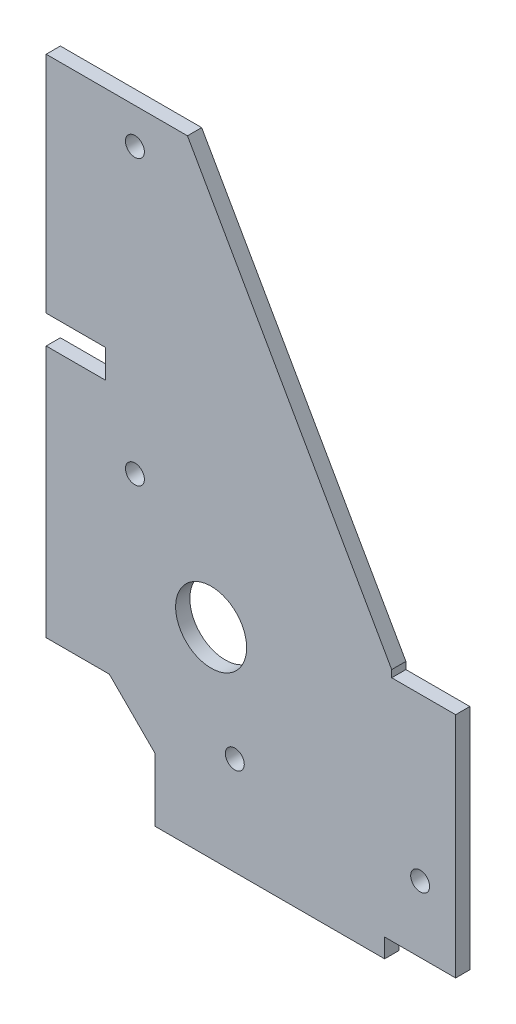
ISO-10303-21;
HEADER;
FILE_DESCRIPTION(('STEP AP214'),'2;1');
FILE_NAME('part.step','',(''),(''),'','','');
FILE_SCHEMA(('AUTOMOTIVE_DESIGN { 1 0 10303 214 1 1 1 1 }'));
ENDSEC;
DATA;
#1=APPLICATION_CONTEXT('core data for automotive mechanical design processes');
#2=APPLICATION_PROTOCOL_DEFINITION('international standard','automotive_design',2000,#1);
#3=PRODUCT_CONTEXT('',#1,'mechanical');
#4=PRODUCT('Part','Part','',(#3));
#5=PRODUCT_RELATED_PRODUCT_CATEGORY('part','',(#4));
#6=PRODUCT_DEFINITION_FORMATION('','',#4);
#7=PRODUCT_DEFINITION_CONTEXT('part definition',#1,'design');
#8=PRODUCT_DEFINITION('design','',#6,#7);
#9=PRODUCT_DEFINITION_SHAPE('','',#8);
#10=(LENGTH_UNIT() NAMED_UNIT(*) SI_UNIT(.MILLI.,.METRE.));
#11=(NAMED_UNIT(*) PLANE_ANGLE_UNIT() SI_UNIT($,.RADIAN.));
#12=(NAMED_UNIT(*) SI_UNIT($,.STERADIAN.) SOLID_ANGLE_UNIT());
#13=UNCERTAINTY_MEASURE_WITH_UNIT(LENGTH_MEASURE(1.E-05),#10,'distance_accuracy_value','');
#14=(GEOMETRIC_REPRESENTATION_CONTEXT(3) GLOBAL_UNCERTAINTY_ASSIGNED_CONTEXT((#13)) GLOBAL_UNIT_ASSIGNED_CONTEXT((#10,
#11,#12)) REPRESENTATION_CONTEXT('',''));
#15=CARTESIAN_POINT('',(0.,0.,0.));
#16=DIRECTION('',(0.,0.,1.));
#17=DIRECTION('',(1.,0.,0.));
#18=AXIS2_PLACEMENT_3D('',#15,#16,#17);
#19=CARTESIAN_POINT('',(173.3,0.,16.));
#20=DIRECTION('',(-1.,0.,0.));
#21=DIRECTION('',(0.,0.,1.));
#22=AXIS2_PLACEMENT_3D('',#19,#20,#21);
#23=PLANE('',#22);
#24=DIRECTION('',(0.,0.,-1.));
#25=VECTOR('',#24,1.);
#26=CARTESIAN_POINT('',(173.3,104.64,16.));
#27=LINE('',#26,#25);
#28=CARTESIAN_POINT('',(173.3,104.64,6.));
#29=VERTEX_POINT('',#28);
#30=CARTESIAN_POINT('',(173.3,104.64,0.));
#31=VERTEX_POINT('',#30);
#32=EDGE_CURVE('E11',#29,#31,#27,.T.);
#33=ORIENTED_EDGE('',*,*,#32,.F.);
#34=DIRECTION('',(0.,1.,0.));
#35=VECTOR('',#34,1.);
#36=CARTESIAN_POINT('',(173.3,60.,6.));
#37=LINE('',#36,#35);
#38=CARTESIAN_POINT('',(173.3,8.3,6.));
#39=VERTEX_POINT('',#38);
#40=EDGE_CURVE('E162',#39,#29,#37,.T.);
#41=ORIENTED_EDGE('',*,*,#40,.F.);
#42=DIRECTION('',(0.,0.,-1.));
#43=VECTOR('',#42,1.);
#44=CARTESIAN_POINT('',(173.3,8.3,6.));
#45=LINE('',#44,#43);
#46=CARTESIAN_POINT('',(173.3,8.3,0.));
#47=VERTEX_POINT('',#46);
#48=EDGE_CURVE('E174',#39,#47,#45,.T.);
#49=ORIENTED_EDGE('',*,*,#48,.T.);
#50=DIRECTION('',(0.,1.,0.));
#51=VECTOR('',#50,1.);
#52=CARTESIAN_POINT('',(173.3,60.,0.));
#53=LINE('',#52,#51);
#54=EDGE_CURVE('E173',#47,#31,#53,.T.);
#55=ORIENTED_EDGE('',*,*,#54,.T.);
#56=EDGE_LOOP('',(#33,#41,#49,#55));
#57=FACE_BOUND('',#56,.T.);
#58=ADVANCED_FACE('F43',(#57),#23,.F.);
#59=CARTESIAN_POINT('',(0.,104.64,16.));
#60=DIRECTION('',(0.,-1.,0.));
#61=DIRECTION('',(1.,0.,0.));
#62=AXIS2_PLACEMENT_3D('',#59,#60,#61);
#63=PLANE('',#62);
#64=DIRECTION('',(1.,0.,0.));
#65=VECTOR('',#64,1.);
#66=CARTESIAN_POINT('',(147.986126126126,104.64,6.));
#67=LINE('',#66,#65);
#68=CARTESIAN_POINT('',(146.286126126126,104.64,6.));
#69=VERTEX_POINT('',#68);
#70=EDGE_CURVE('E150',#69,#29,#67,.T.);
#71=ORIENTED_EDGE('',*,*,#70,.T.);
#72=ORIENTED_EDGE('',*,*,#32,.T.);
#73=DIRECTION('',(-1.,0.,0.));
#74=VECTOR('',#73,1.);
#75=CARTESIAN_POINT('',(173.3,104.64,0.));
#76=LINE('',#75,#74);
#77=CARTESIAN_POINT('',(146.286126126126,104.64,0.));
#78=VERTEX_POINT('',#77);
#79=EDGE_CURVE('E51',#31,#78,#76,.T.);
#80=ORIENTED_EDGE('',*,*,#79,.T.);
#81=DIRECTION('',(0.,0.,1.));
#82=VECTOR('',#81,1.);
#83=CARTESIAN_POINT('',(146.286126126126,104.64,-4.));
#84=LINE('',#83,#82);
#85=EDGE_CURVE('E153',#78,#69,#84,.T.);
#86=ORIENTED_EDGE('',*,*,#85,.T.);
#87=EDGE_LOOP('',(#71,#72,#80,#86));
#88=FACE_BOUND('',#87,.T.);
#89=ADVANCED_FACE('F152',(#88),#63,.F.);
#90=CARTESIAN_POINT('',(0.,0.,0.));
#91=DIRECTION('',(0.,0.,-1.));
#92=DIRECTION('',(-1.,0.,0.));
#93=AXIS2_PLACEMENT_3D('',#90,#91,#92);
#94=PLANE('',#93);
#95=CARTESIAN_POINT('',(80.,41.8,0.));
#96=DIRECTION('',(0.,0.,1.));
#97=DIRECTION('',(1.,0.,0.));
#98=AXIS2_PLACEMENT_3D('',#95,#96,#97);
#99=CIRCLE('',#98,4.00000000000001);
#100=CARTESIAN_POINT('',(84.,41.8,0.));
#101=VERTEX_POINT('',#100);
#102=EDGE_CURVE('E359',#101,#101,#99,.T.);
#103=ORIENTED_EDGE('',*,*,#102,.T.);
#104=EDGE_LOOP('',(#103));
#105=FACE_BOUND('',#104,.T.);
#106=ORIENTED_EDGE('',*,*,#54,.F.);
#107=DIRECTION('',(1.,0.,0.));
#108=VECTOR('',#107,1.);
#109=CARTESIAN_POINT('',(173.3,8.3,0.));
#110=LINE('',#109,#108);
#111=CARTESIAN_POINT('',(143.3,8.29999999999999,0.));
#112=VERTEX_POINT('',#111);
#113=EDGE_CURVE('E220',#112,#47,#110,.T.);
#114=ORIENTED_EDGE('',*,*,#113,.F.);
#115=DIRECTION('',(0.,1.,0.));
#116=VECTOR('',#115,1.);
#117=CARTESIAN_POINT('',(143.3,0.,0.));
#118=LINE('',#117,#116);
#119=CARTESIAN_POINT('',(143.3,0.3,0.));
#120=VERTEX_POINT('',#119);
#121=EDGE_CURVE('E223',#120,#112,#118,.T.);
#122=ORIENTED_EDGE('',*,*,#121,.F.);
#123=DIRECTION('',(-1.,0.,0.));
#124=VECTOR('',#123,1.);
#125=CARTESIAN_POINT('',(0.,0.3,0.));
#126=LINE('',#125,#124);
#127=CARTESIAN_POINT('',(46.3,0.3,0.));
#128=VERTEX_POINT('',#127);
#129=EDGE_CURVE('E278',#120,#128,#126,.T.);
#130=ORIENTED_EDGE('',*,*,#129,.T.);
#131=DIRECTION('',(0.,1.,0.));
#132=VECTOR('',#131,1.);
#133=CARTESIAN_POINT('',(46.3,0.,0.));
#134=LINE('',#133,#132);
#135=CARTESIAN_POINT('',(46.3,27.,0.));
#136=VERTEX_POINT('',#135);
#137=EDGE_CURVE('E240',#128,#136,#134,.T.);
#138=ORIENTED_EDGE('',*,*,#137,.T.);
#139=DIRECTION('',(-0.707106781186548,0.707106781186547,0.));
#140=VECTOR('',#139,1.);
#141=CARTESIAN_POINT('',(36.65,36.65,0.));
#142=LINE('',#141,#140);
#143=CARTESIAN_POINT('',(27.,46.3,0.));
#144=VERTEX_POINT('',#143);
#145=EDGE_CURVE('E193',#136,#144,#142,.T.);
#146=ORIENTED_EDGE('',*,*,#145,.T.);
#147=DIRECTION('',(-1.,0.,0.));
#148=VECTOR('',#147,1.);
#149=CARTESIAN_POINT('',(19.,46.3,0.));
#150=LINE('',#149,#148);
#151=CARTESIAN_POINT('',(0.299999999999995,46.3,0.));
#152=VERTEX_POINT('',#151);
#153=EDGE_CURVE('E226',#144,#152,#150,.T.);
#154=ORIENTED_EDGE('',*,*,#153,.T.);
#155=DIRECTION('',(0.,1.,0.));
#156=VECTOR('',#155,1.);
#157=CARTESIAN_POINT('',(0.299999999999998,259.8,0.));
#158=LINE('',#157,#156);
#159=CARTESIAN_POINT('',(0.299999999999998,153.05,0.));
#160=VERTEX_POINT('',#159);
#161=EDGE_CURVE('E307',#152,#160,#158,.T.);
#162=ORIENTED_EDGE('',*,*,#161,.T.);
#163=DIRECTION('',(1.,0.,0.));
#164=VECTOR('',#163,1.);
#165=CARTESIAN_POINT('',(0.299999999999998,153.05,0.));
#166=LINE('',#165,#164);
#167=CARTESIAN_POINT('',(25.3,153.05,0.));
#168=VERTEX_POINT('',#167);
#169=EDGE_CURVE('E334',#160,#168,#166,.T.);
#170=ORIENTED_EDGE('',*,*,#169,.T.);
#171=DIRECTION('',(0.,1.,0.));
#172=VECTOR('',#171,1.);
#173=CARTESIAN_POINT('',(25.3,153.05,0.));
#174=LINE('',#173,#172);
#175=CARTESIAN_POINT('',(25.3,165.05,0.));
#176=VERTEX_POINT('',#175);
#177=EDGE_CURVE('E346',#168,#176,#174,.T.);
#178=ORIENTED_EDGE('',*,*,#177,.T.);
#179=DIRECTION('',(-1.,0.,0.));
#180=VECTOR('',#179,1.);
#181=CARTESIAN_POINT('',(25.3,165.05,0.));
#182=LINE('',#181,#180);
#183=CARTESIAN_POINT('',(0.299999999999998,165.05,0.));
#184=VERTEX_POINT('',#183);
#185=EDGE_CURVE('E321',#176,#184,#182,.T.);
#186=ORIENTED_EDGE('',*,*,#185,.T.);
#187=CARTESIAN_POINT('',(0.299999999999998,259.8,0.));
#188=VERTEX_POINT('',#187);
#189=EDGE_CURVE('E312',#184,#188,#158,.T.);
#190=ORIENTED_EDGE('',*,*,#189,.T.);
#191=DIRECTION('',(-1.,0.,0.));
#192=VECTOR('',#191,1.);
#193=CARTESIAN_POINT('',(0.,259.8,0.));
#194=LINE('',#193,#192);
#195=CARTESIAN_POINT('',(60.,259.8,0.));
#196=VERTEX_POINT('',#195);
#197=EDGE_CURVE('E212',#196,#188,#194,.T.);
#198=ORIENTED_EDGE('',*,*,#197,.F.);
#199=DIRECTION('',(-0.493276189091162,0.869872750047787,0.));
#200=VECTOR('',#199,1.);
#201=CARTESIAN_POINT('',(60.,259.8,0.));
#202=LINE('',#201,#200);
#203=CARTESIAN_POINT('',(146.286126126126,107.637881729921,0.));
#204=VERTEX_POINT('',#203);
#205=EDGE_CURVE('E217',#204,#196,#202,.T.);
#206=ORIENTED_EDGE('',*,*,#205,.F.);
#207=DIRECTION('',(0.,-1.,0.));
#208=VECTOR('',#207,1.);
#209=CARTESIAN_POINT('',(146.286126126126,0.,0.));
#210=LINE('',#209,#208);
#211=EDGE_CURVE('E179',#204,#78,#210,.T.);
#212=ORIENTED_EDGE('',*,*,#211,.T.);
#213=ORIENTED_EDGE('',*,*,#79,.F.);
#214=EDGE_LOOP('',(#106,#114,#122,#130,#138,#146,#154,#162,#170,#178,#186,#190,#198,#206,#212,#213));
#215=FACE_BOUND('',#214,.T.);
#216=CARTESIAN_POINT('',(37.8,125.,0.));
#217=DIRECTION('',(0.,0.,1.));
#218=DIRECTION('',(1.,0.,0.));
#219=AXIS2_PLACEMENT_3D('',#216,#217,#218);
#220=CIRCLE('',#219,4.00000000000001);
#221=CARTESIAN_POINT('',(41.8,125.,0.));
#222=VERTEX_POINT('',#221);
#223=EDGE_CURVE('E255',#222,#222,#220,.T.);
#224=ORIENTED_EDGE('',*,*,#223,.T.);
#225=EDGE_LOOP('',(#224));
#226=FACE_BOUND('',#225,.T.);
#227=CARTESIAN_POINT('',(37.8,244.8,0.));
#228=DIRECTION('',(0.,0.,1.));
#229=DIRECTION('',(1.,0.,0.));
#230=AXIS2_PLACEMENT_3D('',#227,#228,#229);
#231=CIRCLE('',#230,4.00000000000001);
#232=CARTESIAN_POINT('',(41.8,244.8,0.));
#233=VERTEX_POINT('',#232);
#234=EDGE_CURVE('E254',#233,#233,#231,.T.);
#235=ORIENTED_EDGE('',*,*,#234,.T.);
#236=EDGE_LOOP('',(#235));
#237=FACE_BOUND('',#236,.T.);
#238=CARTESIAN_POINT('',(158.3,36.3,0.));
#239=DIRECTION('',(0.,0.,1.));
#240=DIRECTION('',(1.,0.,0.));
#241=AXIS2_PLACEMENT_3D('',#238,#239,#240);
#242=CIRCLE('',#241,3.99999999999999);
#243=CARTESIAN_POINT('',(162.3,36.3,0.));
#244=VERTEX_POINT('',#243);
#245=EDGE_CURVE('E244',#244,#244,#242,.T.);
#246=ORIENTED_EDGE('',*,*,#245,.T.);
#247=EDGE_LOOP('',(#246));
#248=FACE_BOUND('',#247,.T.);
#249=CARTESIAN_POINT('',(70.,85.,0.));
#250=DIRECTION('',(0.,0.,1.));
#251=DIRECTION('',(1.,0.,0.));
#252=AXIS2_PLACEMENT_3D('',#249,#250,#251);
#253=CIRCLE('',#252,15.);
#254=CARTESIAN_POINT('',(85.,85.,0.));
#255=VERTEX_POINT('',#254);
#256=EDGE_CURVE('E270',#255,#255,#253,.T.);
#257=ORIENTED_EDGE('',*,*,#256,.T.);
#258=EDGE_LOOP('',(#257));
#259=FACE_BOUND('',#258,.T.);
#260=ADVANCED_FACE('F182',(#105,#215,#226,#237,#248,#259),#94,.T.);
#261=CARTESIAN_POINT('',(0.299999999999998,259.8,0.));
#262=DIRECTION('',(1.,0.,0.));
#263=DIRECTION('',(0.,0.,-1.));
#264=AXIS2_PLACEMENT_3D('',#261,#262,#263);
#265=PLANE('',#264);
#266=ORIENTED_EDGE('',*,*,#189,.F.);
#267=DIRECTION('',(0.,0.,1.));
#268=VECTOR('',#267,1.);
#269=CARTESIAN_POINT('',(0.299999999999998,165.05,0.));
#270=LINE('',#269,#268);
#271=CARTESIAN_POINT('',(0.299999999999998,165.05,6.));
#272=VERTEX_POINT('',#271);
#273=EDGE_CURVE('E327',#184,#272,#270,.T.);
#274=ORIENTED_EDGE('',*,*,#273,.T.);
#275=DIRECTION('',(0.,1.,0.));
#276=VECTOR('',#275,1.);
#277=CARTESIAN_POINT('',(0.299999999999998,259.8,6.));
#278=LINE('',#277,#276);
#279=CARTESIAN_POINT('',(0.299999999999998,259.8,6.));
#280=VERTEX_POINT('',#279);
#281=EDGE_CURVE('E313',#272,#280,#278,.T.);
#282=ORIENTED_EDGE('',*,*,#281,.T.);
#283=DIRECTION('',(0.,0.,1.));
#284=VECTOR('',#283,1.);
#285=CARTESIAN_POINT('',(0.299999999999998,259.8,0.));
#286=LINE('',#285,#284);
#287=EDGE_CURVE('E303',#188,#280,#286,.T.);
#288=ORIENTED_EDGE('',*,*,#287,.F.);
#289=EDGE_LOOP('',(#266,#274,#282,#288));
#290=FACE_BOUND('',#289,.T.);
#291=ADVANCED_FACE('F409',(#290),#265,.F.);
#292=CARTESIAN_POINT('',(143.3,0.,6.));
#293=DIRECTION('',(-1.,0.,0.));
#294=DIRECTION('',(0.,0.,1.));
#295=AXIS2_PLACEMENT_3D('',#292,#293,#294);
#296=PLANE('',#295);
#297=DIRECTION('',(0.,1.,0.));
#298=VECTOR('',#297,1.);
#299=CARTESIAN_POINT('',(143.3,0.,6.));
#300=LINE('',#299,#298);
#301=CARTESIAN_POINT('',(143.3,0.3,6.));
#302=VERTEX_POINT('',#301);
#303=CARTESIAN_POINT('',(143.3,8.29999999999999,6.));
#304=VERTEX_POINT('',#303);
#305=EDGE_CURVE('E216',#302,#304,#300,.T.);
#306=ORIENTED_EDGE('',*,*,#305,.F.);
#307=DIRECTION('',(0.,0.,1.));
#308=VECTOR('',#307,1.);
#309=CARTESIAN_POINT('',(143.3,0.3,-4.));
#310=LINE('',#309,#308);
#311=EDGE_CURVE('E285',#120,#302,#310,.T.);
#312=ORIENTED_EDGE('',*,*,#311,.F.);
#313=ORIENTED_EDGE('',*,*,#121,.T.);
#314=DIRECTION('',(0.,0.,-1.));
#315=VECTOR('',#314,1.);
#316=CARTESIAN_POINT('',(143.3,8.29999999999999,6.));
#317=LINE('',#316,#315);
#318=EDGE_CURVE('E201',#304,#112,#317,.T.);
#319=ORIENTED_EDGE('',*,*,#318,.F.);
#320=EDGE_LOOP('',(#306,#312,#313,#319));
#321=FACE_BOUND('',#320,.T.);
#322=ADVANCED_FACE('F412',(#321),#296,.F.);
#323=CARTESIAN_POINT('',(173.3,8.3,6.));
#324=DIRECTION('',(0.,1.,0.));
#325=DIRECTION('',(-1.,0.,0.));
#326=AXIS2_PLACEMENT_3D('',#323,#324,#325);
#327=PLANE('',#326);
#328=ORIENTED_EDGE('',*,*,#113,.T.);
#329=ORIENTED_EDGE('',*,*,#48,.F.);
#330=DIRECTION('',(1.,0.,0.));
#331=VECTOR('',#330,1.);
#332=CARTESIAN_POINT('',(173.3,8.3,6.));
#333=LINE('',#332,#331);
#334=EDGE_CURVE('E166',#304,#39,#333,.T.);
#335=ORIENTED_EDGE('',*,*,#334,.F.);
#336=ORIENTED_EDGE('',*,*,#318,.T.);
#337=EDGE_LOOP('',(#328,#329,#335,#336));
#338=FACE_BOUND('',#337,.T.);
#339=ADVANCED_FACE('F415',(#338),#327,.F.);
#340=CARTESIAN_POINT('',(60.,259.8,6.));
#341=DIRECTION('',(-0.869872750047787,-0.493276189091162,0.));
#342=DIRECTION('',(0.493276189091162,-0.869872750047787,0.));
#343=AXIS2_PLACEMENT_3D('',#340,#341,#342);
#344=PLANE('',#343);
#345=DIRECTION('',(-0.493276189091162,0.869872750047787,0.));
#346=VECTOR('',#345,1.);
#347=CARTESIAN_POINT('',(60.,259.8,6.));
#348=LINE('',#347,#346);
#349=CARTESIAN_POINT('',(146.286126126126,107.637881729921,6.));
#350=VERTEX_POINT('',#349);
#351=CARTESIAN_POINT('',(60.,259.8,6.));
#352=VERTEX_POINT('',#351);
#353=EDGE_CURVE('E171',#350,#352,#348,.T.);
#354=ORIENTED_EDGE('',*,*,#353,.F.);
#355=DIRECTION('',(0.,0.,1.));
#356=VECTOR('',#355,1.);
#357=CARTESIAN_POINT('',(146.286126126126,107.637881729921,-4.));
#358=LINE('',#357,#356);
#359=EDGE_CURVE('E158',#204,#350,#358,.T.);
#360=ORIENTED_EDGE('',*,*,#359,.F.);
#361=ORIENTED_EDGE('',*,*,#205,.T.);
#362=DIRECTION('',(0.,0.,-1.));
#363=VECTOR('',#362,1.);
#364=CARTESIAN_POINT('',(60.,259.8,6.));
#365=LINE('',#364,#363);
#366=EDGE_CURVE('E207',#352,#196,#365,.T.);
#367=ORIENTED_EDGE('',*,*,#366,.F.);
#368=EDGE_LOOP('',(#354,#360,#361,#367));
#369=FACE_BOUND('',#368,.T.);
#370=ADVANCED_FACE('F419',(#369),#344,.F.);
#371=CARTESIAN_POINT('',(0.,259.8,6.));
#372=DIRECTION('',(0.,-1.,0.));
#373=DIRECTION('',(0.,0.,-1.));
#374=AXIS2_PLACEMENT_3D('',#371,#372,#373);
#375=PLANE('',#374);
#376=ORIENTED_EDGE('',*,*,#197,.T.);
#377=ORIENTED_EDGE('',*,*,#287,.T.);
#378=DIRECTION('',(-1.,0.,0.));
#379=VECTOR('',#378,1.);
#380=CARTESIAN_POINT('',(0.,259.8,6.));
#381=LINE('',#380,#379);
#382=EDGE_CURVE('E211',#352,#280,#381,.T.);
#383=ORIENTED_EDGE('',*,*,#382,.F.);
#384=ORIENTED_EDGE('',*,*,#366,.T.);
#385=EDGE_LOOP('',(#376,#377,#383,#384));
#386=FACE_BOUND('',#385,.T.);
#387=ADVANCED_FACE('F379',(#386),#375,.F.);
#388=CARTESIAN_POINT('',(0.,0.,6.));
#389=DIRECTION('',(0.,0.,1.));
#390=DIRECTION('',(1.,0.,0.));
#391=AXIS2_PLACEMENT_3D('',#388,#389,#390);
#392=PLANE('',#391);
#393=CARTESIAN_POINT('',(80.,41.8,6.));
#394=DIRECTION('',(0.,0.,1.));
#395=DIRECTION('',(1.,0.,0.));
#396=AXIS2_PLACEMENT_3D('',#393,#394,#395);
#397=CIRCLE('',#396,4.00000000000001);
#398=CARTESIAN_POINT('',(84.,41.8,6.));
#399=VERTEX_POINT('',#398);
#400=EDGE_CURVE('E360',#399,#399,#397,.T.);
#401=ORIENTED_EDGE('',*,*,#400,.F.);
#402=EDGE_LOOP('',(#401));
#403=FACE_BOUND('',#402,.T.);
#404=CARTESIAN_POINT('',(158.3,36.3,6.));
#405=DIRECTION('',(0.,0.,1.));
#406=DIRECTION('',(1.,0.,0.));
#407=AXIS2_PLACEMENT_3D('',#404,#405,#406);
#408=CIRCLE('',#407,3.99999999999999);
#409=CARTESIAN_POINT('',(162.3,36.3,6.));
#410=VERTEX_POINT('',#409);
#411=EDGE_CURVE('E259',#410,#410,#408,.T.);
#412=ORIENTED_EDGE('',*,*,#411,.F.);
#413=EDGE_LOOP('',(#412));
#414=FACE_BOUND('',#413,.T.);
#415=ORIENTED_EDGE('',*,*,#40,.T.);
#416=ORIENTED_EDGE('',*,*,#70,.F.);
#417=DIRECTION('',(0.,-1.,0.));
#418=VECTOR('',#417,1.);
#419=CARTESIAN_POINT('',(146.286126126126,104.64,6.));
#420=LINE('',#419,#418);
#421=EDGE_CURVE('E159',#350,#69,#420,.T.);
#422=ORIENTED_EDGE('',*,*,#421,.F.);
#423=ORIENTED_EDGE('',*,*,#353,.T.);
#424=ORIENTED_EDGE('',*,*,#382,.T.);
#425=ORIENTED_EDGE('',*,*,#281,.F.);
#426=DIRECTION('',(-1.,0.,0.));
#427=VECTOR('',#426,1.);
#428=CARTESIAN_POINT('',(25.3,165.05,6.));
#429=LINE('',#428,#427);
#430=CARTESIAN_POINT('',(25.3,165.05,6.));
#431=VERTEX_POINT('',#430);
#432=EDGE_CURVE('E331',#431,#272,#429,.T.);
#433=ORIENTED_EDGE('',*,*,#432,.F.);
#434=DIRECTION('',(0.,1.,0.));
#435=VECTOR('',#434,1.);
#436=CARTESIAN_POINT('',(25.3,153.05,6.));
#437=LINE('',#436,#435);
#438=CARTESIAN_POINT('',(25.3,153.05,6.));
#439=VERTEX_POINT('',#438);
#440=EDGE_CURVE('E335',#439,#431,#437,.T.);
#441=ORIENTED_EDGE('',*,*,#440,.F.);
#442=DIRECTION('',(1.,0.,0.));
#443=VECTOR('',#442,1.);
#444=CARTESIAN_POINT('',(0.299999999999998,153.05,6.));
#445=LINE('',#444,#443);
#446=CARTESIAN_POINT('',(0.299999999999998,153.05,6.));
#447=VERTEX_POINT('',#446);
#448=EDGE_CURVE('E339',#447,#439,#445,.T.);
#449=ORIENTED_EDGE('',*,*,#448,.F.);
#450=CARTESIAN_POINT('',(0.299999999999998,46.3,6.));
#451=VERTEX_POINT('',#450);
#452=EDGE_CURVE('E308',#451,#447,#278,.T.);
#453=ORIENTED_EDGE('',*,*,#452,.F.);
#454=DIRECTION('',(-1.,0.,0.));
#455=VECTOR('',#454,1.);
#456=CARTESIAN_POINT('',(19.,46.3,6.));
#457=LINE('',#456,#455);
#458=CARTESIAN_POINT('',(27.,46.3,6.));
#459=VERTEX_POINT('',#458);
#460=EDGE_CURVE('E236',#459,#451,#457,.T.);
#461=ORIENTED_EDGE('',*,*,#460,.F.);
#462=DIRECTION('',(-0.707106781186548,0.707106781186547,0.));
#463=VECTOR('',#462,1.);
#464=CARTESIAN_POINT('',(46.3,27.,6.));
#465=LINE('',#464,#463);
#466=CARTESIAN_POINT('',(46.3,27.,6.));
#467=VERTEX_POINT('',#466);
#468=EDGE_CURVE('E296',#467,#459,#465,.T.);
#469=ORIENTED_EDGE('',*,*,#468,.F.);
#470=DIRECTION('',(0.,1.,0.));
#471=VECTOR('',#470,1.);
#472=CARTESIAN_POINT('',(46.3,0.,6.));
#473=LINE('',#472,#471);
#474=CARTESIAN_POINT('',(46.3,0.3,6.));
#475=VERTEX_POINT('',#474);
#476=EDGE_CURVE('E241',#475,#467,#473,.T.);
#477=ORIENTED_EDGE('',*,*,#476,.F.);
#478=DIRECTION('',(-1.,0.,0.));
#479=VECTOR('',#478,1.);
#480=CARTESIAN_POINT('',(143.3,0.3,6.));
#481=LINE('',#480,#479);
#482=EDGE_CURVE('E288',#302,#475,#481,.T.);
#483=ORIENTED_EDGE('',*,*,#482,.F.);
#484=ORIENTED_EDGE('',*,*,#305,.T.);
#485=ORIENTED_EDGE('',*,*,#334,.T.);
#486=EDGE_LOOP('',(#415,#416,#422,#423,#424,#425,#433,#441,#449,#453,#461,#469,#477,#483,#484,#485));
#487=FACE_BOUND('',#486,.T.);
#488=CARTESIAN_POINT('',(37.8,125.,6.));
#489=DIRECTION('',(0.,0.,1.));
#490=DIRECTION('',(1.,0.,0.));
#491=AXIS2_PLACEMENT_3D('',#488,#489,#490);
#492=CIRCLE('',#491,4.00000000000001);
#493=CARTESIAN_POINT('',(41.8,125.,6.));
#494=VERTEX_POINT('',#493);
#495=EDGE_CURVE('E266',#494,#494,#492,.T.);
#496=ORIENTED_EDGE('',*,*,#495,.F.);
#497=EDGE_LOOP('',(#496));
#498=FACE_BOUND('',#497,.T.);
#499=CARTESIAN_POINT('',(37.8,244.8,6.));
#500=DIRECTION('',(0.,0.,1.));
#501=DIRECTION('',(1.,0.,0.));
#502=AXIS2_PLACEMENT_3D('',#499,#500,#501);
#503=CIRCLE('',#502,4.00000000000001);
#504=CARTESIAN_POINT('',(41.8,244.8,6.));
#505=VERTEX_POINT('',#504);
#506=EDGE_CURVE('E250',#505,#505,#503,.T.);
#507=ORIENTED_EDGE('',*,*,#506,.F.);
#508=EDGE_LOOP('',(#507));
#509=FACE_BOUND('',#508,.T.);
#510=CARTESIAN_POINT('',(70.,85.,6.));
#511=DIRECTION('',(0.,0.,1.));
#512=DIRECTION('',(1.,0.,0.));
#513=AXIS2_PLACEMENT_3D('',#510,#511,#512);
#514=CIRCLE('',#513,15.);
#515=CARTESIAN_POINT('',(85.,85.,6.));
#516=VERTEX_POINT('',#515);
#517=EDGE_CURVE('E274',#516,#516,#514,.T.);
#518=ORIENTED_EDGE('',*,*,#517,.F.);
#519=EDGE_LOOP('',(#518));
#520=FACE_BOUND('',#519,.T.);
#521=ADVANCED_FACE('F163',(#403,#414,#487,#498,#509,#520),#392,.T.);
#522=CARTESIAN_POINT('',(19.,46.3,0.));
#523=DIRECTION('',(0.,1.,0.));
#524=DIRECTION('',(-1.,0.,0.));
#525=AXIS2_PLACEMENT_3D('',#522,#523,#524);
#526=PLANE('',#525);
#527=ORIENTED_EDGE('',*,*,#460,.T.);
#528=DIRECTION('',(0.,0.,-1.));
#529=VECTOR('',#528,1.);
#530=CARTESIAN_POINT('',(0.299999999999998,46.3,0.));
#531=LINE('',#530,#529);
#532=EDGE_CURVE('E189',#451,#152,#531,.T.);
#533=ORIENTED_EDGE('',*,*,#532,.T.);
#534=ORIENTED_EDGE('',*,*,#153,.F.);
#535=DIRECTION('',(0.,0.,1.));
#536=VECTOR('',#535,1.);
#537=CARTESIAN_POINT('',(27.,46.3,-4.));
#538=LINE('',#537,#536);
#539=EDGE_CURVE('E291',#144,#459,#538,.T.);
#540=ORIENTED_EDGE('',*,*,#539,.T.);
#541=EDGE_LOOP('',(#527,#533,#534,#540));
#542=FACE_BOUND('',#541,.T.);
#543=ADVANCED_FACE('F378',(#542),#526,.F.);
#544=CARTESIAN_POINT('',(46.3,0.,0.));
#545=DIRECTION('',(1.,0.,0.));
#546=DIRECTION('',(0.,0.,-1.));
#547=AXIS2_PLACEMENT_3D('',#544,#545,#546);
#548=PLANE('',#547);
#549=ORIENTED_EDGE('',*,*,#137,.F.);
#550=DIRECTION('',(0.,0.,1.));
#551=VECTOR('',#550,1.);
#552=CARTESIAN_POINT('',(46.3,0.3,0.));
#553=LINE('',#552,#551);
#554=EDGE_CURVE('E197',#128,#475,#553,.T.);
#555=ORIENTED_EDGE('',*,*,#554,.T.);
#556=ORIENTED_EDGE('',*,*,#476,.T.);
#557=DIRECTION('',(0.,0.,1.));
#558=VECTOR('',#557,1.);
#559=CARTESIAN_POINT('',(46.3,27.,-4.));
#560=LINE('',#559,#558);
#561=EDGE_CURVE('E292',#136,#467,#560,.T.);
#562=ORIENTED_EDGE('',*,*,#561,.F.);
#563=EDGE_LOOP('',(#549,#555,#556,#562));
#564=FACE_BOUND('',#563,.T.);
#565=ADVANCED_FACE('F396',(#564),#548,.F.);
#566=CARTESIAN_POINT('',(70.,85.,0.));
#567=DIRECTION('',(0.,0.,1.));
#568=DIRECTION('',(1.,0.,0.));
#569=AXIS2_PLACEMENT_3D('',#566,#567,#568);
#570=CYLINDRICAL_SURFACE('',#569,15.);
#571=ORIENTED_EDGE('',*,*,#256,.F.);
#572=EDGE_LOOP('',(#571));
#573=FACE_BOUND('',#572,.T.);
#574=ORIENTED_EDGE('',*,*,#517,.T.);
#575=EDGE_LOOP('',(#574));
#576=FACE_BOUND('',#575,.T.);
#577=ADVANCED_FACE('F386',(#573,#576),#570,.F.);
#578=CARTESIAN_POINT('',(158.3,36.3,0.));
#579=DIRECTION('',(0.,0.,1.));
#580=DIRECTION('',(1.,0.,0.));
#581=AXIS2_PLACEMENT_3D('',#578,#579,#580);
#582=CYLINDRICAL_SURFACE('',#581,3.99999999999999);
#583=ORIENTED_EDGE('',*,*,#245,.F.);
#584=EDGE_LOOP('',(#583));
#585=FACE_BOUND('',#584,.T.);
#586=ORIENTED_EDGE('',*,*,#411,.T.);
#587=EDGE_LOOP('',(#586));
#588=FACE_BOUND('',#587,.T.);
#589=ADVANCED_FACE('F383',(#585,#588),#582,.F.);
#590=CARTESIAN_POINT('',(37.8,244.8,0.));
#591=DIRECTION('',(0.,0.,1.));
#592=DIRECTION('',(1.,0.,0.));
#593=AXIS2_PLACEMENT_3D('',#590,#591,#592);
#594=CYLINDRICAL_SURFACE('',#593,4.00000000000001);
#595=ORIENTED_EDGE('',*,*,#234,.F.);
#596=EDGE_LOOP('',(#595));
#597=FACE_BOUND('',#596,.T.);
#598=ORIENTED_EDGE('',*,*,#506,.T.);
#599=EDGE_LOOP('',(#598));
#600=FACE_BOUND('',#599,.T.);
#601=ADVANCED_FACE('F385',(#597,#600),#594,.F.);
#602=CARTESIAN_POINT('',(37.8,125.,0.));
#603=DIRECTION('',(0.,0.,1.));
#604=DIRECTION('',(1.,0.,0.));
#605=AXIS2_PLACEMENT_3D('',#602,#603,#604);
#606=CYLINDRICAL_SURFACE('',#605,4.00000000000001);
#607=ORIENTED_EDGE('',*,*,#223,.F.);
#608=EDGE_LOOP('',(#607));
#609=FACE_BOUND('',#608,.T.);
#610=ORIENTED_EDGE('',*,*,#495,.T.);
#611=EDGE_LOOP('',(#610));
#612=FACE_BOUND('',#611,.T.);
#613=ADVANCED_FACE('F393',(#609,#612),#606,.F.);
#614=CARTESIAN_POINT('',(143.3,0.3,-4.));
#615=DIRECTION('',(0.,1.,0.));
#616=DIRECTION('',(0.,0.,1.));
#617=AXIS2_PLACEMENT_3D('',#614,#615,#616);
#618=PLANE('',#617);
#619=ORIENTED_EDGE('',*,*,#311,.T.);
#620=ORIENTED_EDGE('',*,*,#482,.T.);
#621=ORIENTED_EDGE('',*,*,#554,.F.);
#622=ORIENTED_EDGE('',*,*,#129,.F.);
#623=EDGE_LOOP('',(#619,#620,#621,#622));
#624=FACE_BOUND('',#623,.T.);
#625=ADVANCED_FACE('F454',(#624),#618,.F.);
#626=CARTESIAN_POINT('',(46.3,27.,-4.));
#627=DIRECTION('',(0.707106781186547,0.707106781186548,0.));
#628=DIRECTION('',(-0.707106781186548,0.707106781186547,0.));
#629=AXIS2_PLACEMENT_3D('',#626,#627,#628);
#630=PLANE('',#629);
#631=ORIENTED_EDGE('',*,*,#561,.T.);
#632=ORIENTED_EDGE('',*,*,#468,.T.);
#633=ORIENTED_EDGE('',*,*,#539,.F.);
#634=ORIENTED_EDGE('',*,*,#145,.F.);
#635=EDGE_LOOP('',(#631,#632,#633,#634));
#636=FACE_BOUND('',#635,.T.);
#637=ADVANCED_FACE('F445',(#636),#630,.F.);
#638=ORIENTED_EDGE('',*,*,#452,.T.);
#639=DIRECTION('',(0.,0.,1.));
#640=VECTOR('',#639,1.);
#641=CARTESIAN_POINT('',(0.299999999999998,153.05,0.));
#642=LINE('',#641,#640);
#643=EDGE_CURVE('E317',#160,#447,#642,.T.);
#644=ORIENTED_EDGE('',*,*,#643,.F.);
#645=ORIENTED_EDGE('',*,*,#161,.F.);
#646=ORIENTED_EDGE('',*,*,#532,.F.);
#647=EDGE_LOOP('',(#638,#644,#645,#646));
#648=FACE_BOUND('',#647,.T.);
#649=ADVANCED_FACE('F442',(#648),#265,.F.);
#650=CARTESIAN_POINT('',(25.3,165.05,0.));
#651=DIRECTION('',(0.,1.,0.));
#652=DIRECTION('',(0.,0.,1.));
#653=AXIS2_PLACEMENT_3D('',#650,#651,#652);
#654=PLANE('',#653);
#655=ORIENTED_EDGE('',*,*,#432,.T.);
#656=ORIENTED_EDGE('',*,*,#273,.F.);
#657=ORIENTED_EDGE('',*,*,#185,.F.);
#658=DIRECTION('',(0.,0.,1.));
#659=VECTOR('',#658,1.);
#660=CARTESIAN_POINT('',(25.3,165.05,0.));
#661=LINE('',#660,#659);
#662=EDGE_CURVE('E324',#176,#431,#661,.T.);
#663=ORIENTED_EDGE('',*,*,#662,.T.);
#664=EDGE_LOOP('',(#655,#656,#657,#663));
#665=FACE_BOUND('',#664,.T.);
#666=ADVANCED_FACE('F466',(#665),#654,.F.);
#667=CARTESIAN_POINT('',(25.3,153.05,0.));
#668=DIRECTION('',(1.,0.,0.));
#669=DIRECTION('',(0.,1.,0.));
#670=AXIS2_PLACEMENT_3D('',#667,#668,#669);
#671=PLANE('',#670);
#672=ORIENTED_EDGE('',*,*,#440,.T.);
#673=ORIENTED_EDGE('',*,*,#662,.F.);
#674=ORIENTED_EDGE('',*,*,#177,.F.);
#675=DIRECTION('',(0.,0.,1.));
#676=VECTOR('',#675,1.);
#677=CARTESIAN_POINT('',(25.3,153.05,0.));
#678=LINE('',#677,#676);
#679=EDGE_CURVE('E320',#168,#439,#678,.T.);
#680=ORIENTED_EDGE('',*,*,#679,.T.);
#681=EDGE_LOOP('',(#672,#673,#674,#680));
#682=FACE_BOUND('',#681,.T.);
#683=ADVANCED_FACE('F470',(#682),#671,.F.);
#684=CARTESIAN_POINT('',(0.299999999999998,153.05,0.));
#685=DIRECTION('',(0.,-1.,0.));
#686=DIRECTION('',(0.,0.,-1.));
#687=AXIS2_PLACEMENT_3D('',#684,#685,#686);
#688=PLANE('',#687);
#689=ORIENTED_EDGE('',*,*,#448,.T.);
#690=ORIENTED_EDGE('',*,*,#679,.F.);
#691=ORIENTED_EDGE('',*,*,#169,.F.);
#692=ORIENTED_EDGE('',*,*,#643,.T.);
#693=EDGE_LOOP('',(#689,#690,#691,#692));
#694=FACE_BOUND('',#693,.T.);
#695=ADVANCED_FACE('F467',(#694),#688,.F.);
#696=CARTESIAN_POINT('',(146.286126126126,104.64,-4.));
#697=DIRECTION('',(-1.,0.,0.));
#698=DIRECTION('',(0.,0.,1.));
#699=AXIS2_PLACEMENT_3D('',#696,#697,#698);
#700=PLANE('',#699);
#701=ORIENTED_EDGE('',*,*,#359,.T.);
#702=ORIENTED_EDGE('',*,*,#421,.T.);
#703=ORIENTED_EDGE('',*,*,#85,.F.);
#704=ORIENTED_EDGE('',*,*,#211,.F.);
#705=EDGE_LOOP('',(#701,#702,#703,#704));
#706=FACE_BOUND('',#705,.T.);
#707=ADVANCED_FACE('F372',(#706),#700,.F.);
#708=CARTESIAN_POINT('',(80.,41.8,0.));
#709=DIRECTION('',(0.,0.,1.));
#710=DIRECTION('',(1.,0.,0.));
#711=AXIS2_PLACEMENT_3D('',#708,#709,#710);
#712=CYLINDRICAL_SURFACE('',#711,4.00000000000001);
#713=ORIENTED_EDGE('',*,*,#102,.F.);
#714=EDGE_LOOP('',(#713));
#715=FACE_BOUND('',#714,.T.);
#716=ORIENTED_EDGE('',*,*,#400,.T.);
#717=EDGE_LOOP('',(#716));
#718=FACE_BOUND('',#717,.T.);
#719=ADVANCED_FACE('F369',(#715,#718),#712,.F.);
#720=CLOSED_SHELL('',(#58,#89,#260,#291,#322,#339,#370,#387,#521,#543,#565,#577,#589,#601,#613,
#625,#637,#649,#666,#683,#695,#707,#719));
#721=MANIFOLD_SOLID_BREP('B2',#720);
#722=ADVANCED_BREP_SHAPE_REPRESENTATION('',(#18,#721),#14);
#723=SHAPE_DEFINITION_REPRESENTATION(#9,#722);
ENDSEC;
END-ISO-10303-21;
